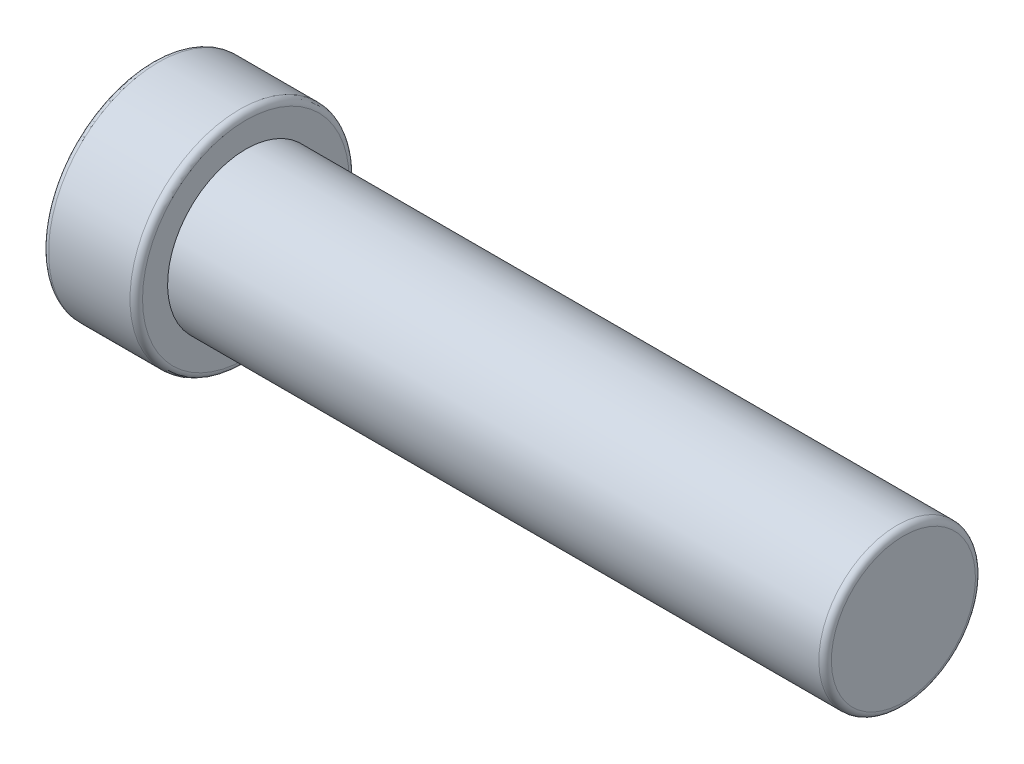
ISO-10303-21;
HEADER;
FILE_DESCRIPTION(('STEP AP214'),'2;1');
FILE_NAME('part.step','',(''),(''),'','','');
FILE_SCHEMA(('AUTOMOTIVE_DESIGN { 1 0 10303 214 1 1 1 1 }'));
ENDSEC;
DATA;
#1=APPLICATION_CONTEXT('core data for automotive mechanical design processes');
#2=APPLICATION_PROTOCOL_DEFINITION('international standard','automotive_design',2000,#1);
#3=PRODUCT_CONTEXT('',#1,'mechanical');
#4=PRODUCT('Part','Part','',(#3));
#5=PRODUCT_RELATED_PRODUCT_CATEGORY('part','',(#4));
#6=PRODUCT_DEFINITION_FORMATION('','',#4);
#7=PRODUCT_DEFINITION_CONTEXT('part definition',#1,'design');
#8=PRODUCT_DEFINITION('design','',#6,#7);
#9=PRODUCT_DEFINITION_SHAPE('','',#8);
#10=(LENGTH_UNIT() NAMED_UNIT(*) SI_UNIT(.MILLI.,.METRE.));
#11=(NAMED_UNIT(*) PLANE_ANGLE_UNIT() SI_UNIT($,.RADIAN.));
#12=(NAMED_UNIT(*) SI_UNIT($,.STERADIAN.) SOLID_ANGLE_UNIT());
#13=UNCERTAINTY_MEASURE_WITH_UNIT(LENGTH_MEASURE(1.E-05),#10,'distance_accuracy_value','');
#14=(GEOMETRIC_REPRESENTATION_CONTEXT(3) GLOBAL_UNCERTAINTY_ASSIGNED_CONTEXT((#13)) GLOBAL_UNIT_ASSIGNED_CONTEXT((#10,
#11,#12)) REPRESENTATION_CONTEXT('',''));
#15=CARTESIAN_POINT('',(0.,0.,0.));
#16=DIRECTION('',(0.,0.,1.));
#17=DIRECTION('',(1.,0.,0.));
#18=AXIS2_PLACEMENT_3D('',#15,#16,#17);
#19=CARTESIAN_POINT('',(0.,2.5,0.));
#20=DIRECTION('',(1.,0.,0.));
#21=DIRECTION('',(0.,1.,0.));
#22=AXIS2_PLACEMENT_3D('',#19,#20,#21);
#23=PLANE('',#22);
#24=CARTESIAN_POINT('',(0.,0.,0.));
#25=DIRECTION('',(1.,0.,0.));
#26=DIRECTION('',(0.,1.,0.));
#27=AXIS2_PLACEMENT_3D('',#24,#25,#26);
#28=CIRCLE('',#27,2.3);
#29=CARTESIAN_POINT('',(0.,2.3,0.));
#30=VERTEX_POINT('',#29);
#31=EDGE_CURVE('E143',#30,#30,#28,.T.);
#32=ORIENTED_EDGE('',*,*,#31,.T.);
#33=EDGE_LOOP('',(#32));
#34=FACE_BOUND('',#33,.T.);
#35=ADVANCED_FACE('F33',(#34),#23,.T.);
#36=CARTESIAN_POINT('',(-24.,0.,0.));
#37=DIRECTION('',(-1.,0.,0.));
#38=DIRECTION('',(0.,-1.,0.));
#39=AXIS2_PLACEMENT_3D('',#36,#37,#38);
#40=PLANE('',#39);
#41=DIRECTION('',(0.,0.5,-0.866025403784439));
#42=VECTOR('',#41,1.);
#43=CARTESIAN_POINT('',(-24.,0.999999999999999,1.73205080756888));
#44=LINE('',#43,#42);
#45=CARTESIAN_POINT('',(-24.,0.999999999999999,1.73205080756888));
#46=VERTEX_POINT('',#45);
#47=CARTESIAN_POINT('',(-24.,2.,0.));
#48=VERTEX_POINT('',#47);
#49=EDGE_CURVE('E48',#46,#48,#44,.T.);
#50=ORIENTED_EDGE('',*,*,#49,.F.);
#51=DIRECTION('',(0.,1.,0.));
#52=VECTOR('',#51,1.);
#53=CARTESIAN_POINT('',(-24.,-1.,1.73205080756888));
#54=LINE('',#53,#52);
#55=CARTESIAN_POINT('',(-24.,-1.,1.73205080756888));
#56=VERTEX_POINT('',#55);
#57=EDGE_CURVE('E131',#56,#46,#54,.T.);
#58=ORIENTED_EDGE('',*,*,#57,.F.);
#59=DIRECTION('',(0.,0.5,0.866025403784439));
#60=VECTOR('',#59,1.);
#61=CARTESIAN_POINT('',(-24.,-2.,0.));
#62=LINE('',#61,#60);
#63=CARTESIAN_POINT('',(-24.,-2.,0.));
#64=VERTEX_POINT('',#63);
#65=EDGE_CURVE('E129',#64,#56,#62,.T.);
#66=ORIENTED_EDGE('',*,*,#65,.F.);
#67=DIRECTION('',(0.,-0.5,0.866025403784439));
#68=VECTOR('',#67,1.);
#69=CARTESIAN_POINT('',(-24.,-1.,-1.73205080756888));
#70=LINE('',#69,#68);
#71=CARTESIAN_POINT('',(-24.,-1.,-1.73205080756888));
#72=VERTEX_POINT('',#71);
#73=EDGE_CURVE('E96',#72,#64,#70,.T.);
#74=ORIENTED_EDGE('',*,*,#73,.F.);
#75=DIRECTION('',(0.,-1.,0.));
#76=VECTOR('',#75,1.);
#77=CARTESIAN_POINT('',(-24.,0.999999999999997,-1.73205080756888));
#78=LINE('',#77,#76);
#79=CARTESIAN_POINT('',(-24.,0.999999999999997,-1.73205080756888));
#80=VERTEX_POINT('',#79);
#81=EDGE_CURVE('E125',#80,#72,#78,.T.);
#82=ORIENTED_EDGE('',*,*,#81,.F.);
#83=DIRECTION('',(0.,-0.5,-0.866025403784439));
#84=VECTOR('',#83,1.);
#85=CARTESIAN_POINT('',(-24.,2.,0.));
#86=LINE('',#85,#84);
#87=EDGE_CURVE('E122',#48,#80,#86,.T.);
#88=ORIENTED_EDGE('',*,*,#87,.F.);
#89=EDGE_LOOP('',(#50,#58,#66,#74,#82,#88));
#90=FACE_BOUND('',#89,.T.);
#91=CARTESIAN_POINT('',(-24.,0.,0.));
#92=DIRECTION('',(-1.,0.,0.));
#93=DIRECTION('',(0.,-1.,0.));
#94=AXIS2_PLACEMENT_3D('',#91,#92,#93);
#95=CIRCLE('',#94,3.3);
#96=CARTESIAN_POINT('',(-24.,-3.3,0.));
#97=VERTEX_POINT('',#96);
#98=EDGE_CURVE('E11',#97,#97,#95,.T.);
#99=ORIENTED_EDGE('',*,*,#98,.T.);
#100=EDGE_LOOP('',(#99));
#101=FACE_BOUND('',#100,.T.);
#102=ADVANCED_FACE('F184',(#90,#101),#40,.T.);
#103=CARTESIAN_POINT('',(0.,0.,0.));
#104=DIRECTION('',(1.,0.,0.));
#105=DIRECTION('',(0.,1.,0.));
#106=AXIS2_PLACEMENT_3D('',#103,#104,#105);
#107=CYLINDRICAL_SURFACE('',#106,3.5);
#108=CARTESIAN_POINT('',(-21.2,0.,0.));
#109=DIRECTION('',(1.,0.,0.));
#110=DIRECTION('',(0.,1.,0.));
#111=AXIS2_PLACEMENT_3D('',#108,#109,#110);
#112=CIRCLE('',#111,3.5);
#113=CARTESIAN_POINT('',(-21.2,3.5,0.));
#114=VERTEX_POINT('',#113);
#115=EDGE_CURVE('E41',#114,#114,#112,.F.);
#116=ORIENTED_EDGE('',*,*,#115,.T.);
#117=EDGE_LOOP('',(#116));
#118=FACE_BOUND('',#117,.T.);
#119=CARTESIAN_POINT('',(-23.8,0.,0.));
#120=DIRECTION('',(-1.,0.,0.));
#121=DIRECTION('',(0.,-1.,0.));
#122=AXIS2_PLACEMENT_3D('',#119,#120,#121);
#123=CIRCLE('',#122,3.5);
#124=CARTESIAN_POINT('',(-23.8,-3.5,0.));
#125=VERTEX_POINT('',#124);
#126=EDGE_CURVE('E152',#125,#125,#123,.F.);
#127=ORIENTED_EDGE('',*,*,#126,.T.);
#128=EDGE_LOOP('',(#127));
#129=FACE_BOUND('',#128,.T.);
#130=ADVANCED_FACE('F157',(#118,#129),#107,.T.);
#131=CARTESIAN_POINT('',(-21.,3.5,0.));
#132=DIRECTION('',(1.,0.,0.));
#133=DIRECTION('',(0.,1.,0.));
#134=AXIS2_PLACEMENT_3D('',#131,#132,#133);
#135=PLANE('',#134);
#136=CARTESIAN_POINT('',(-21.,0.,0.));
#137=DIRECTION('',(1.,0.,0.));
#138=DIRECTION('',(0.,1.,0.));
#139=AXIS2_PLACEMENT_3D('',#136,#137,#138);
#140=CIRCLE('',#139,3.3);
#141=CARTESIAN_POINT('',(-21.,3.3,0.));
#142=VERTEX_POINT('',#141);
#143=EDGE_CURVE('E149',#142,#142,#140,.T.);
#144=ORIENTED_EDGE('',*,*,#143,.T.);
#145=EDGE_LOOP('',(#144));
#146=FACE_BOUND('',#145,.T.);
#147=CARTESIAN_POINT('',(-21.,0.,0.));
#148=DIRECTION('',(1.,0.,0.));
#149=DIRECTION('',(0.,1.,0.));
#150=AXIS2_PLACEMENT_3D('',#147,#148,#149);
#151=CIRCLE('',#150,2.5);
#152=CARTESIAN_POINT('',(-21.,2.5,0.));
#153=VERTEX_POINT('',#152);
#154=EDGE_CURVE('E135',#153,#153,#151,.T.);
#155=ORIENTED_EDGE('',*,*,#154,.F.);
#156=EDGE_LOOP('',(#155));
#157=FACE_BOUND('',#156,.T.);
#158=ADVANCED_FACE('F166',(#146,#157),#135,.T.);
#159=CARTESIAN_POINT('',(0.,0.,0.));
#160=DIRECTION('',(1.,0.,0.));
#161=DIRECTION('',(0.,1.,0.));
#162=AXIS2_PLACEMENT_3D('',#159,#160,#161);
#163=CYLINDRICAL_SURFACE('',#162,2.5);
#164=CARTESIAN_POINT('',(-0.2,0.,0.));
#165=DIRECTION('',(1.,0.,0.));
#166=DIRECTION('',(0.,1.,0.));
#167=AXIS2_PLACEMENT_3D('',#164,#165,#166);
#168=CIRCLE('',#167,2.5);
#169=CARTESIAN_POINT('',(-0.2,2.5,0.));
#170=VERTEX_POINT('',#169);
#171=EDGE_CURVE('E146',#170,#170,#168,.F.);
#172=ORIENTED_EDGE('',*,*,#171,.T.);
#173=EDGE_LOOP('',(#172));
#174=FACE_BOUND('',#173,.T.);
#175=ORIENTED_EDGE('',*,*,#154,.T.);
#176=EDGE_LOOP('',(#175));
#177=FACE_BOUND('',#176,.T.);
#178=ADVANCED_FACE('F169',(#174,#177),#163,.T.);
#179=CARTESIAN_POINT('',(-0.2,0.,0.));
#180=DIRECTION('',(1.,0.,0.));
#181=DIRECTION('',(0.,1.,0.));
#182=AXIS2_PLACEMENT_3D('',#179,#180,#181);
#183=TOROIDAL_SURFACE('',#182,2.3,0.2);
#184=ORIENTED_EDGE('',*,*,#171,.F.);
#185=EDGE_LOOP('',(#184));
#186=FACE_BOUND('',#185,.T.);
#187=ORIENTED_EDGE('',*,*,#31,.F.);
#188=EDGE_LOOP('',(#187));
#189=FACE_BOUND('',#188,.T.);
#190=ADVANCED_FACE('F163',(#186,#189),#183,.T.);
#191=CARTESIAN_POINT('',(-21.2,0.,0.));
#192=DIRECTION('',(1.,0.,0.));
#193=DIRECTION('',(0.,1.,0.));
#194=AXIS2_PLACEMENT_3D('',#191,#192,#193);
#195=TOROIDAL_SURFACE('',#194,3.3,0.2);
#196=ORIENTED_EDGE('',*,*,#115,.F.);
#197=EDGE_LOOP('',(#196));
#198=FACE_BOUND('',#197,.T.);
#199=ORIENTED_EDGE('',*,*,#143,.F.);
#200=EDGE_LOOP('',(#199));
#201=FACE_BOUND('',#200,.T.);
#202=ADVANCED_FACE('F160',(#198,#201),#195,.T.);
#203=CARTESIAN_POINT('',(-23.8,0.,0.));
#204=DIRECTION('',(-1.,0.,0.));
#205=DIRECTION('',(0.,-1.,0.));
#206=AXIS2_PLACEMENT_3D('',#203,#204,#205);
#207=TOROIDAL_SURFACE('',#206,3.3,0.2);
#208=ORIENTED_EDGE('',*,*,#98,.F.);
#209=EDGE_LOOP('',(#208));
#210=FACE_BOUND('',#209,.T.);
#211=ORIENTED_EDGE('',*,*,#126,.F.);
#212=EDGE_LOOP('',(#211));
#213=FACE_BOUND('',#212,.T.);
#214=ADVANCED_FACE('F35',(#210,#213),#207,.T.);
#215=CARTESIAN_POINT('',(-21.,0.999999999999999,1.73205080756888));
#216=DIRECTION('',(0.,0.866025403784439,0.5));
#217=DIRECTION('',(0.,-0.5,0.866025403784439));
#218=AXIS2_PLACEMENT_3D('',#215,#216,#217);
#219=PLANE('',#218);
#220=ORIENTED_EDGE('',*,*,#49,.T.);
#221=DIRECTION('',(-1.,0.,0.));
#222=VECTOR('',#221,1.);
#223=CARTESIAN_POINT('',(-21.,2.,0.));
#224=LINE('',#223,#222);
#225=CARTESIAN_POINT('',(-21.,2.,0.));
#226=VERTEX_POINT('',#225);
#227=EDGE_CURVE('E78',#226,#48,#224,.T.);
#228=ORIENTED_EDGE('',*,*,#227,.F.);
#229=DIRECTION('',(0.,0.5,-0.866025403784439));
#230=VECTOR('',#229,1.);
#231=CARTESIAN_POINT('',(-21.,0.999999999999999,1.73205080756888));
#232=LINE('',#231,#230);
#233=CARTESIAN_POINT('',(-21.,0.999999999999999,1.73205080756888));
#234=VERTEX_POINT('',#233);
#235=EDGE_CURVE('E133',#234,#226,#232,.T.);
#236=ORIENTED_EDGE('',*,*,#235,.F.);
#237=DIRECTION('',(-1.,0.,0.));
#238=VECTOR('',#237,1.);
#239=CARTESIAN_POINT('',(-21.,0.999999999999999,1.73205080756888));
#240=LINE('',#239,#238);
#241=EDGE_CURVE('E56',#234,#46,#240,.T.);
#242=ORIENTED_EDGE('',*,*,#241,.T.);
#243=EDGE_LOOP('',(#220,#228,#236,#242));
#244=FACE_BOUND('',#243,.T.);
#245=ADVANCED_FACE('F220',(#244),#219,.F.);
#246=CARTESIAN_POINT('',(-21.,-1.,1.73205080756888));
#247=DIRECTION('',(0.,0.,1.));
#248=DIRECTION('',(0.,-1.,0.));
#249=AXIS2_PLACEMENT_3D('',#246,#247,#248);
#250=PLANE('',#249);
#251=ORIENTED_EDGE('',*,*,#57,.T.);
#252=ORIENTED_EDGE('',*,*,#241,.F.);
#253=DIRECTION('',(0.,1.,0.));
#254=VECTOR('',#253,1.);
#255=CARTESIAN_POINT('',(-21.,-1.,1.73205080756888));
#256=LINE('',#255,#254);
#257=CARTESIAN_POINT('',(-21.,-1.,1.73205080756888));
#258=VERTEX_POINT('',#257);
#259=EDGE_CURVE('E108',#258,#234,#256,.T.);
#260=ORIENTED_EDGE('',*,*,#259,.F.);
#261=DIRECTION('',(-1.,0.,0.));
#262=VECTOR('',#261,1.);
#263=CARTESIAN_POINT('',(-21.,-1.,1.73205080756888));
#264=LINE('',#263,#262);
#265=EDGE_CURVE('E100',#258,#56,#264,.T.);
#266=ORIENTED_EDGE('',*,*,#265,.T.);
#267=EDGE_LOOP('',(#251,#252,#260,#266));
#268=FACE_BOUND('',#267,.T.);
#269=ADVANCED_FACE('F227',(#268),#250,.F.);
#270=CARTESIAN_POINT('',(-21.,-2.,0.));
#271=DIRECTION('',(0.,-0.866025403784439,0.5));
#272=DIRECTION('',(0.,-0.5,-0.866025403784439));
#273=AXIS2_PLACEMENT_3D('',#270,#271,#272);
#274=PLANE('',#273);
#275=ORIENTED_EDGE('',*,*,#65,.T.);
#276=ORIENTED_EDGE('',*,*,#265,.F.);
#277=DIRECTION('',(0.,0.5,0.866025403784439));
#278=VECTOR('',#277,1.);
#279=CARTESIAN_POINT('',(-21.,-2.,0.));
#280=LINE('',#279,#278);
#281=CARTESIAN_POINT('',(-21.,-2.,0.));
#282=VERTEX_POINT('',#281);
#283=EDGE_CURVE('E104',#282,#258,#280,.T.);
#284=ORIENTED_EDGE('',*,*,#283,.F.);
#285=DIRECTION('',(-1.,0.,0.));
#286=VECTOR('',#285,1.);
#287=CARTESIAN_POINT('',(-21.,-2.,0.));
#288=LINE('',#287,#286);
#289=EDGE_CURVE('E89',#282,#64,#288,.T.);
#290=ORIENTED_EDGE('',*,*,#289,.T.);
#291=EDGE_LOOP('',(#275,#276,#284,#290));
#292=FACE_BOUND('',#291,.T.);
#293=ADVANCED_FACE('F105',(#292),#274,.F.);
#294=CARTESIAN_POINT('',(-21.,-1.,-1.73205080756888));
#295=DIRECTION('',(0.,-0.866025403784439,-0.5));
#296=DIRECTION('',(0.,0.5,-0.866025403784439));
#297=AXIS2_PLACEMENT_3D('',#294,#295,#296);
#298=PLANE('',#297);
#299=ORIENTED_EDGE('',*,*,#73,.T.);
#300=ORIENTED_EDGE('',*,*,#289,.F.);
#301=DIRECTION('',(0.,-0.5,0.866025403784439));
#302=VECTOR('',#301,1.);
#303=CARTESIAN_POINT('',(-21.,-1.,-1.73205080756888));
#304=LINE('',#303,#302);
#305=CARTESIAN_POINT('',(-21.,-1.,-1.73205080756888));
#306=VERTEX_POINT('',#305);
#307=EDGE_CURVE('E93',#306,#282,#304,.T.);
#308=ORIENTED_EDGE('',*,*,#307,.F.);
#309=DIRECTION('',(-1.,0.,0.));
#310=VECTOR('',#309,1.);
#311=CARTESIAN_POINT('',(-21.,-1.,-1.73205080756888));
#312=LINE('',#311,#310);
#313=EDGE_CURVE('E101',#306,#72,#312,.T.);
#314=ORIENTED_EDGE('',*,*,#313,.T.);
#315=EDGE_LOOP('',(#299,#300,#308,#314));
#316=FACE_BOUND('',#315,.T.);
#317=ADVANCED_FACE('F91',(#316),#298,.F.);
#318=CARTESIAN_POINT('',(-21.,0.999999999999998,-1.73205080756888));
#319=DIRECTION('',(0.,0.,-1.));
#320=DIRECTION('',(0.,1.,0.));
#321=AXIS2_PLACEMENT_3D('',#318,#319,#320);
#322=PLANE('',#321);
#323=ORIENTED_EDGE('',*,*,#81,.T.);
#324=ORIENTED_EDGE('',*,*,#313,.F.);
#325=DIRECTION('',(0.,-1.,0.));
#326=VECTOR('',#325,1.);
#327=CARTESIAN_POINT('',(-21.,0.999999999999998,-1.73205080756888));
#328=LINE('',#327,#326);
#329=CARTESIAN_POINT('',(-21.,0.999999999999998,-1.73205080756888));
#330=VERTEX_POINT('',#329);
#331=EDGE_CURVE('E114',#330,#306,#328,.T.);
#332=ORIENTED_EDGE('',*,*,#331,.F.);
#333=DIRECTION('',(-1.,0.,0.));
#334=VECTOR('',#333,1.);
#335=CARTESIAN_POINT('',(-21.,0.999999999999998,-1.73205080756888));
#336=LINE('',#335,#334);
#337=EDGE_CURVE('E138',#330,#80,#336,.T.);
#338=ORIENTED_EDGE('',*,*,#337,.T.);
#339=EDGE_LOOP('',(#323,#324,#332,#338));
#340=FACE_BOUND('',#339,.T.);
#341=ADVANCED_FACE('F245',(#340),#322,.F.);
#342=CARTESIAN_POINT('',(-21.,2.,0.));
#343=DIRECTION('',(0.,0.866025403784438,-0.5));
#344=DIRECTION('',(0.,0.5,0.866025403784439));
#345=AXIS2_PLACEMENT_3D('',#342,#343,#344);
#346=PLANE('',#345);
#347=ORIENTED_EDGE('',*,*,#87,.T.);
#348=ORIENTED_EDGE('',*,*,#337,.F.);
#349=DIRECTION('',(0.,-0.5,-0.866025403784439));
#350=VECTOR('',#349,1.);
#351=CARTESIAN_POINT('',(-21.,2.,0.));
#352=LINE('',#351,#350);
#353=EDGE_CURVE('E116',#226,#330,#352,.T.);
#354=ORIENTED_EDGE('',*,*,#353,.F.);
#355=ORIENTED_EDGE('',*,*,#227,.T.);
#356=EDGE_LOOP('',(#347,#348,#354,#355));
#357=FACE_BOUND('',#356,.T.);
#358=ADVANCED_FACE('F252',(#357),#346,.F.);
#359=CARTESIAN_POINT('',(-21.,0.,0.));
#360=DIRECTION('',(-1.,0.,0.));
#361=DIRECTION('',(0.,0.,1.));
#362=AXIS2_PLACEMENT_3D('',#359,#360,#361);
#363=PLANE('',#362);
#364=ORIENTED_EDGE('',*,*,#235,.T.);
#365=ORIENTED_EDGE('',*,*,#353,.T.);
#366=ORIENTED_EDGE('',*,*,#331,.T.);
#367=ORIENTED_EDGE('',*,*,#307,.T.);
#368=ORIENTED_EDGE('',*,*,#283,.T.);
#369=ORIENTED_EDGE('',*,*,#259,.T.);
#370=EDGE_LOOP('',(#364,#365,#366,#367,#368,#369));
#371=FACE_BOUND('',#370,.T.);
#372=ADVANCED_FACE('F111',(#371),#363,.T.);
#373=CLOSED_SHELL('',(#35,#102,#130,#158,#178,#190,#202,#214,#245,#269,#293,#317,#341,#358,#372));
#374=MANIFOLD_SOLID_BREP('B2',#373);
#375=ADVANCED_BREP_SHAPE_REPRESENTATION('',(#18,#374),#14);
#376=SHAPE_DEFINITION_REPRESENTATION(#9,#375);
ENDSEC;
END-ISO-10303-21;
